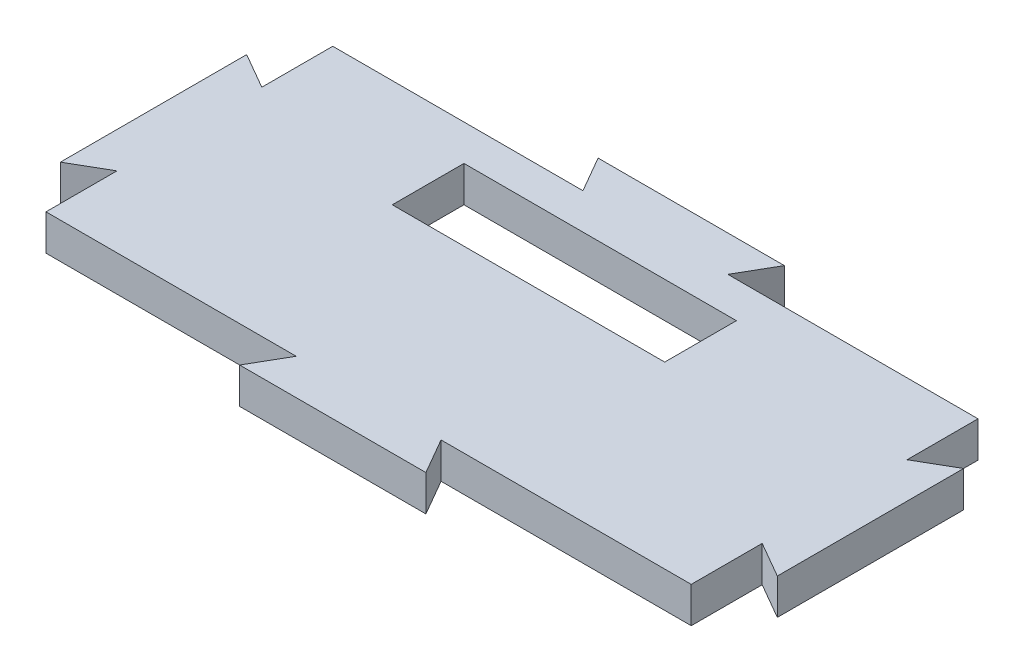
ISO-10303-21;
HEADER;
FILE_DESCRIPTION(('STEP AP214'),'2;1');
FILE_NAME('part.step','',(''),(''),'','','');
FILE_SCHEMA(('AUTOMOTIVE_DESIGN { 1 0 10303 214 1 1 1 1 }'));
ENDSEC;
DATA;
#1=APPLICATION_CONTEXT('core data for automotive mechanical design processes');
#2=APPLICATION_PROTOCOL_DEFINITION('international standard','automotive_design',2000,#1);
#3=PRODUCT_CONTEXT('',#1,'mechanical');
#4=PRODUCT('Part','Part','',(#3));
#5=PRODUCT_RELATED_PRODUCT_CATEGORY('part','',(#4));
#6=PRODUCT_DEFINITION_FORMATION('','',#4);
#7=PRODUCT_DEFINITION_CONTEXT('part definition',#1,'design');
#8=PRODUCT_DEFINITION('design','',#6,#7);
#9=PRODUCT_DEFINITION_SHAPE('','',#8);
#10=(LENGTH_UNIT() NAMED_UNIT(*) SI_UNIT(.MILLI.,.METRE.));
#11=(NAMED_UNIT(*) PLANE_ANGLE_UNIT() SI_UNIT($,.RADIAN.));
#12=(NAMED_UNIT(*) SI_UNIT($,.STERADIAN.) SOLID_ANGLE_UNIT());
#13=UNCERTAINTY_MEASURE_WITH_UNIT(LENGTH_MEASURE(1.E-05),#10,'distance_accuracy_value','');
#14=(GEOMETRIC_REPRESENTATION_CONTEXT(3) GLOBAL_UNCERTAINTY_ASSIGNED_CONTEXT((#13)) GLOBAL_UNIT_ASSIGNED_CONTEXT((#10,
#11,#12)) REPRESENTATION_CONTEXT('',''));
#15=CARTESIAN_POINT('',(0.,0.,0.));
#16=DIRECTION('',(0.,0.,1.));
#17=DIRECTION('',(1.,0.,0.));
#18=AXIS2_PLACEMENT_3D('',#15,#16,#17);
#19=CARTESIAN_POINT('',(0.,5.,0.));
#20=DIRECTION('',(0.,1.,0.));
#21=DIRECTION('',(0.,0.,1.));
#22=AXIS2_PLACEMENT_3D('',#19,#20,#21);
#23=PLANE('',#22);
#24=DIRECTION('',(1.,0.,0.));
#25=VECTOR('',#24,1.);
#26=CARTESIAN_POINT('',(16.3,5.,-5.));
#27=LINE('',#26,#25);
#28=CARTESIAN_POINT('',(-21.7,5.,-4.99999999999999));
#29=VERTEX_POINT('',#28);
#30=CARTESIAN_POINT('',(16.3,5.,-5.));
#31=VERTEX_POINT('',#30);
#32=EDGE_CURVE('E559',#29,#31,#27,.T.);
#33=ORIENTED_EDGE('',*,*,#32,.F.);
#34=DIRECTION('',(0.,0.,1.));
#35=VECTOR('',#34,1.);
#36=CARTESIAN_POINT('',(-21.7,5.,-15.));
#37=LINE('',#36,#35);
#38=CARTESIAN_POINT('',(-21.7,5.,-15.));
#39=VERTEX_POINT('',#38);
#40=EDGE_CURVE('E722',#39,#29,#37,.T.);
#41=ORIENTED_EDGE('',*,*,#40,.F.);
#42=DIRECTION('',(-1.,0.,0.));
#43=VECTOR('',#42,1.);
#44=CARTESIAN_POINT('',(16.3,5.,-15.));
#45=LINE('',#44,#43);
#46=CARTESIAN_POINT('',(16.3,5.,-15.));
#47=VERTEX_POINT('',#46);
#48=EDGE_CURVE('E707',#47,#39,#45,.T.);
#49=ORIENTED_EDGE('',*,*,#48,.F.);
#50=DIRECTION('',(0.,0.,-1.));
#51=VECTOR('',#50,1.);
#52=CARTESIAN_POINT('',(16.3,5.,-7.52957321654772));
#53=LINE('',#52,#51);
#54=EDGE_CURVE('E720',#31,#47,#53,.T.);
#55=ORIENTED_EDGE('',*,*,#54,.F.);
#56=EDGE_LOOP('',(#33,#41,#49,#55));
#57=FACE_BOUND('',#56,.T.);
#58=DIRECTION('',(0.866025403784438,0.,-0.5));
#59=VECTOR('',#58,1.);
#60=CARTESIAN_POINT('',(-50.,5.,12.9903810567666));
#61=LINE('',#60,#59);
#62=CARTESIAN_POINT('',(-50.,5.,12.9903810567666));
#63=VERTEX_POINT('',#62);
#64=CARTESIAN_POINT('',(-45.,5.,10.1036297108185));
#65=VERTEX_POINT('',#64);
#66=EDGE_CURVE('E795',#63,#65,#61,.T.);
#67=ORIENTED_EDGE('',*,*,#66,.T.);
#68=DIRECTION('',(0.,0.,1.));
#69=VECTOR('',#68,1.);
#70=CARTESIAN_POINT('',(-45.,5.,0.));
#71=LINE('',#70,#69);
#72=CARTESIAN_POINT('',(-45.,5.,20.));
#73=VERTEX_POINT('',#72);
#74=EDGE_CURVE('E734',#65,#73,#71,.T.);
#75=ORIENTED_EDGE('',*,*,#74,.T.);
#76=DIRECTION('',(-1.,0.,0.));
#77=VECTOR('',#76,1.);
#78=CARTESIAN_POINT('',(0.,5.,20.));
#79=LINE('',#78,#77);
#80=CARTESIAN_POINT('',(-10.1036297108184,5.,20.));
#81=VERTEX_POINT('',#80);
#82=EDGE_CURVE('E738',#81,#73,#79,.T.);
#83=ORIENTED_EDGE('',*,*,#82,.F.);
#84=DIRECTION('',(-0.5,0.,0.866025403784439));
#85=VECTOR('',#84,1.);
#86=CARTESIAN_POINT('',(0.,5.,2.49999999999999));
#87=LINE('',#86,#85);
#88=CARTESIAN_POINT('',(-12.9903810567666,5.,25.));
#89=VERTEX_POINT('',#88);
#90=EDGE_CURVE('E831',#81,#89,#87,.T.);
#91=ORIENTED_EDGE('',*,*,#90,.T.);
#92=DIRECTION('',(1.,0.,0.));
#93=VECTOR('',#92,1.);
#94=CARTESIAN_POINT('',(-12.9903810567666,5.,25.));
#95=LINE('',#94,#93);
#96=CARTESIAN_POINT('',(12.9903810567666,5.,25.));
#97=VERTEX_POINT('',#96);
#98=EDGE_CURVE('E834',#89,#97,#95,.T.);
#99=ORIENTED_EDGE('',*,*,#98,.T.);
#100=DIRECTION('',(-0.5,0.,-0.866025403784438));
#101=VECTOR('',#100,1.);
#102=CARTESIAN_POINT('',(12.9903810567666,5.,25.));
#103=LINE('',#102,#101);
#104=CARTESIAN_POINT('',(10.1036297108185,5.,20.));
#105=VERTEX_POINT('',#104);
#106=EDGE_CURVE('E839',#97,#105,#103,.T.);
#107=ORIENTED_EDGE('',*,*,#106,.T.);
#108=CARTESIAN_POINT('',(45.,5.,20.));
#109=VERTEX_POINT('',#108);
#110=EDGE_CURVE('E742',#109,#105,#79,.T.);
#111=ORIENTED_EDGE('',*,*,#110,.F.);
#112=DIRECTION('',(0.,0.,1.));
#113=VECTOR('',#112,1.);
#114=CARTESIAN_POINT('',(45.,5.,0.));
#115=LINE('',#114,#113);
#116=CARTESIAN_POINT('',(45.,5.,10.1036297108185));
#117=VERTEX_POINT('',#116);
#118=EDGE_CURVE('E745',#117,#109,#115,.T.);
#119=ORIENTED_EDGE('',*,*,#118,.F.);
#120=DIRECTION('',(-0.866025403784438,0.,-0.5));
#121=VECTOR('',#120,1.);
#122=CARTESIAN_POINT('',(50.,5.,12.9903810567666));
#123=LINE('',#122,#121);
#124=CARTESIAN_POINT('',(50.,5.,12.9903810567666));
#125=VERTEX_POINT('',#124);
#126=EDGE_CURVE('E818',#125,#117,#123,.T.);
#127=ORIENTED_EDGE('',*,*,#126,.F.);
#128=DIRECTION('',(0.,0.,1.));
#129=VECTOR('',#128,1.);
#130=CARTESIAN_POINT('',(50.,5.,-12.9903810567666));
#131=LINE('',#130,#129);
#132=CARTESIAN_POINT('',(50.,5.,-12.9903810567666));
#133=VERTEX_POINT('',#132);
#134=EDGE_CURVE('E812',#133,#125,#131,.T.);
#135=ORIENTED_EDGE('',*,*,#134,.F.);
#136=DIRECTION('',(0.866025403784438,0.,-0.5));
#137=VECTOR('',#136,1.);
#138=CARTESIAN_POINT('',(27.5,5.,0.));
#139=LINE('',#138,#137);
#140=CARTESIAN_POINT('',(45.,5.,-10.1036297108185));
#141=VERTEX_POINT('',#140);
#142=EDGE_CURVE('E815',#141,#133,#139,.T.);
#143=ORIENTED_EDGE('',*,*,#142,.F.);
#144=CARTESIAN_POINT('',(45.,5.,-20.));
#145=VERTEX_POINT('',#144);
#146=EDGE_CURVE('E743',#145,#141,#115,.T.);
#147=ORIENTED_EDGE('',*,*,#146,.F.);
#148=DIRECTION('',(-1.,0.,0.));
#149=VECTOR('',#148,1.);
#150=CARTESIAN_POINT('',(0.,5.,-20.));
#151=LINE('',#150,#149);
#152=CARTESIAN_POINT('',(10.1036297108185,5.,-20.));
#153=VERTEX_POINT('',#152);
#154=EDGE_CURVE('E748',#145,#153,#151,.T.);
#155=ORIENTED_EDGE('',*,*,#154,.T.);
#156=DIRECTION('',(-0.5,0.,0.866025403784438));
#157=VECTOR('',#156,1.);
#158=CARTESIAN_POINT('',(12.9903810567666,5.,-25.));
#159=LINE('',#158,#157);
#160=CARTESIAN_POINT('',(12.9903810567666,5.,-25.));
#161=VERTEX_POINT('',#160);
#162=EDGE_CURVE('E854',#161,#153,#159,.T.);
#163=ORIENTED_EDGE('',*,*,#162,.F.);
#164=DIRECTION('',(1.,0.,0.));
#165=VECTOR('',#164,1.);
#166=CARTESIAN_POINT('',(-12.9903810567666,5.,-25.));
#167=LINE('',#166,#165);
#168=CARTESIAN_POINT('',(-12.9903810567666,5.,-25.));
#169=VERTEX_POINT('',#168);
#170=EDGE_CURVE('E860',#169,#161,#167,.T.);
#171=ORIENTED_EDGE('',*,*,#170,.F.);
#172=DIRECTION('',(-0.5,0.,-0.866025403784439));
#173=VECTOR('',#172,1.);
#174=CARTESIAN_POINT('',(0.,5.,-2.49999999999999));
#175=LINE('',#174,#173);
#176=CARTESIAN_POINT('',(-10.1036297108184,5.,-20.));
#177=VERTEX_POINT('',#176);
#178=EDGE_CURVE('E858',#177,#169,#175,.T.);
#179=ORIENTED_EDGE('',*,*,#178,.F.);
#180=CARTESIAN_POINT('',(-45.,5.,-20.));
#181=VERTEX_POINT('',#180);
#182=EDGE_CURVE('E750',#177,#181,#151,.T.);
#183=ORIENTED_EDGE('',*,*,#182,.T.);
#184=CARTESIAN_POINT('',(-45.,5.,-10.1036297108184));
#185=VERTEX_POINT('',#184);
#186=EDGE_CURVE('E736',#181,#185,#71,.T.);
#187=ORIENTED_EDGE('',*,*,#186,.T.);
#188=DIRECTION('',(-0.866025403784438,0.,-0.5));
#189=VECTOR('',#188,1.);
#190=CARTESIAN_POINT('',(-27.5,5.,0.));
#191=LINE('',#190,#189);
#192=CARTESIAN_POINT('',(-50.,5.,-12.9903810567666));
#193=VERTEX_POINT('',#192);
#194=EDGE_CURVE('E794',#185,#193,#191,.T.);
#195=ORIENTED_EDGE('',*,*,#194,.T.);
#196=DIRECTION('',(0.,0.,1.));
#197=VECTOR('',#196,1.);
#198=CARTESIAN_POINT('',(-50.,5.,-12.9903810567666));
#199=LINE('',#198,#197);
#200=EDGE_CURVE('E799',#193,#63,#199,.T.);
#201=ORIENTED_EDGE('',*,*,#200,.T.);
#202=EDGE_LOOP('',(#67,#75,#83,#91,#99,#107,#111,#119,#127,#135,#143,#147,#155,#163,#171,#179,
#183,#187,#195,#201));
#203=FACE_BOUND('',#202,.T.);
#204=ADVANCED_FACE('F544',(#57,#203),#23,.T.);
#205=CARTESIAN_POINT('',(0.,0.,0.));
#206=DIRECTION('',(0.,1.,0.));
#207=DIRECTION('',(0.,0.,1.));
#208=AXIS2_PLACEMENT_3D('',#205,#206,#207);
#209=PLANE('',#208);
#210=DIRECTION('',(0.,0.,1.));
#211=VECTOR('',#210,1.);
#212=CARTESIAN_POINT('',(-21.7,0.,0.));
#213=LINE('',#212,#211);
#214=CARTESIAN_POINT('',(-21.7,0.,-15.));
#215=VERTEX_POINT('',#214);
#216=CARTESIAN_POINT('',(-21.7,0.,-4.99999999999999));
#217=VERTEX_POINT('',#216);
#218=EDGE_CURVE('E554',#215,#217,#213,.T.);
#219=ORIENTED_EDGE('',*,*,#218,.T.);
#220=DIRECTION('',(1.,0.,0.));
#221=VECTOR('',#220,1.);
#222=CARTESIAN_POINT('',(0.,0.,-4.99999999999999));
#223=LINE('',#222,#221);
#224=CARTESIAN_POINT('',(16.3,0.,-5.));
#225=VERTEX_POINT('',#224);
#226=EDGE_CURVE('E12',#217,#225,#223,.T.);
#227=ORIENTED_EDGE('',*,*,#226,.T.);
#228=DIRECTION('',(0.,0.,-1.));
#229=VECTOR('',#228,1.);
#230=CARTESIAN_POINT('',(16.3,0.,0.));
#231=LINE('',#230,#229);
#232=CARTESIAN_POINT('',(16.3,0.,-15.));
#233=VERTEX_POINT('',#232);
#234=EDGE_CURVE('E793',#225,#233,#231,.T.);
#235=ORIENTED_EDGE('',*,*,#234,.T.);
#236=DIRECTION('',(-1.,0.,0.));
#237=VECTOR('',#236,1.);
#238=CARTESIAN_POINT('',(0.,0.,-15.));
#239=LINE('',#238,#237);
#240=EDGE_CURVE('E715',#233,#215,#239,.T.);
#241=ORIENTED_EDGE('',*,*,#240,.T.);
#242=EDGE_LOOP('',(#219,#227,#235,#241));
#243=FACE_BOUND('',#242,.T.);
#244=DIRECTION('',(0.,0.,1.));
#245=VECTOR('',#244,1.);
#246=CARTESIAN_POINT('',(-45.,0.,0.));
#247=LINE('',#246,#245);
#248=CARTESIAN_POINT('',(-45.,0.,10.1036297108185));
#249=VERTEX_POINT('',#248);
#250=CARTESIAN_POINT('',(-45.,0.,20.));
#251=VERTEX_POINT('',#250);
#252=EDGE_CURVE('E749',#249,#251,#247,.T.);
#253=ORIENTED_EDGE('',*,*,#252,.F.);
#254=DIRECTION('',(0.866025403784438,0.,-0.5));
#255=VECTOR('',#254,1.);
#256=CARTESIAN_POINT('',(-50.,0.,12.9903810567666));
#257=LINE('',#256,#255);
#258=CARTESIAN_POINT('',(-50.,0.,12.9903810567666));
#259=VERTEX_POINT('',#258);
#260=EDGE_CURVE('E803',#259,#249,#257,.T.);
#261=ORIENTED_EDGE('',*,*,#260,.F.);
#262=DIRECTION('',(0.,0.,1.));
#263=VECTOR('',#262,1.);
#264=CARTESIAN_POINT('',(-50.,0.,-12.9903810567666));
#265=LINE('',#264,#263);
#266=CARTESIAN_POINT('',(-50.,0.,-12.9903810567666));
#267=VERTEX_POINT('',#266);
#268=EDGE_CURVE('E797',#267,#259,#265,.T.);
#269=ORIENTED_EDGE('',*,*,#268,.F.);
#270=DIRECTION('',(-0.866025403784438,0.,-0.5));
#271=VECTOR('',#270,1.);
#272=CARTESIAN_POINT('',(-27.5,0.,0.));
#273=LINE('',#272,#271);
#274=CARTESIAN_POINT('',(-45.,0.,-10.1036297108184));
#275=VERTEX_POINT('',#274);
#276=EDGE_CURVE('E805',#275,#267,#273,.T.);
#277=ORIENTED_EDGE('',*,*,#276,.F.);
#278=CARTESIAN_POINT('',(-45.,0.,-20.));
#279=VERTEX_POINT('',#278);
#280=EDGE_CURVE('E740',#279,#275,#247,.T.);
#281=ORIENTED_EDGE('',*,*,#280,.F.);
#282=DIRECTION('',(-1.,0.,0.));
#283=VECTOR('',#282,1.);
#284=CARTESIAN_POINT('',(0.,0.,-20.));
#285=LINE('',#284,#283);
#286=CARTESIAN_POINT('',(-10.1036297108184,0.,-20.));
#287=VERTEX_POINT('',#286);
#288=EDGE_CURVE('E764',#287,#279,#285,.T.);
#289=ORIENTED_EDGE('',*,*,#288,.F.);
#290=DIRECTION('',(-0.5,0.,-0.866025403784439));
#291=VECTOR('',#290,1.);
#292=CARTESIAN_POINT('',(0.,0.,-2.49999999999999));
#293=LINE('',#292,#291);
#294=CARTESIAN_POINT('',(-12.9903810567666,0.,-25.));
#295=VERTEX_POINT('',#294);
#296=EDGE_CURVE('E862',#287,#295,#293,.T.);
#297=ORIENTED_EDGE('',*,*,#296,.T.);
#298=DIRECTION('',(1.,0.,0.));
#299=VECTOR('',#298,1.);
#300=CARTESIAN_POINT('',(-12.9903810567666,0.,-25.));
#301=LINE('',#300,#299);
#302=CARTESIAN_POINT('',(12.9903810567666,0.,-25.));
#303=VERTEX_POINT('',#302);
#304=EDGE_CURVE('E857',#295,#303,#301,.T.);
#305=ORIENTED_EDGE('',*,*,#304,.T.);
#306=DIRECTION('',(-0.5,0.,0.866025403784438));
#307=VECTOR('',#306,1.);
#308=CARTESIAN_POINT('',(12.9903810567666,0.,-25.));
#309=LINE('',#308,#307);
#310=CARTESIAN_POINT('',(10.1036297108185,0.,-20.));
#311=VERTEX_POINT('',#310);
#312=EDGE_CURVE('E728',#303,#311,#309,.T.);
#313=ORIENTED_EDGE('',*,*,#312,.T.);
#314=CARTESIAN_POINT('',(45.,0.,-20.));
#315=VERTEX_POINT('',#314);
#316=EDGE_CURVE('E765',#315,#311,#285,.T.);
#317=ORIENTED_EDGE('',*,*,#316,.F.);
#318=DIRECTION('',(0.,0.,1.));
#319=VECTOR('',#318,1.);
#320=CARTESIAN_POINT('',(45.,0.,0.));
#321=LINE('',#320,#319);
#322=CARTESIAN_POINT('',(45.,0.,-10.1036297108185));
#323=VERTEX_POINT('',#322);
#324=EDGE_CURVE('E761',#315,#323,#321,.T.);
#325=ORIENTED_EDGE('',*,*,#324,.T.);
#326=DIRECTION('',(0.866025403784438,0.,-0.5));
#327=VECTOR('',#326,1.);
#328=CARTESIAN_POINT('',(27.5,0.,0.));
#329=LINE('',#328,#327);
#330=CARTESIAN_POINT('',(50.,0.,-12.9903810567666));
#331=VERTEX_POINT('',#330);
#332=EDGE_CURVE('E825',#323,#331,#329,.T.);
#333=ORIENTED_EDGE('',*,*,#332,.T.);
#334=DIRECTION('',(0.,0.,1.));
#335=VECTOR('',#334,1.);
#336=CARTESIAN_POINT('',(50.,0.,-12.9903810567666));
#337=LINE('',#336,#335);
#338=CARTESIAN_POINT('',(50.,0.,12.9903810567666));
#339=VERTEX_POINT('',#338);
#340=EDGE_CURVE('E823',#331,#339,#337,.T.);
#341=ORIENTED_EDGE('',*,*,#340,.T.);
#342=DIRECTION('',(-0.866025403784438,0.,-0.5));
#343=VECTOR('',#342,1.);
#344=CARTESIAN_POINT('',(50.,0.,12.9903810567666));
#345=LINE('',#344,#343);
#346=CARTESIAN_POINT('',(45.,0.,10.1036297108185));
#347=VERTEX_POINT('',#346);
#348=EDGE_CURVE('E814',#339,#347,#345,.T.);
#349=ORIENTED_EDGE('',*,*,#348,.T.);
#350=CARTESIAN_POINT('',(45.,0.,20.));
#351=VERTEX_POINT('',#350);
#352=EDGE_CURVE('E758',#347,#351,#321,.T.);
#353=ORIENTED_EDGE('',*,*,#352,.T.);
#354=DIRECTION('',(-1.,0.,0.));
#355=VECTOR('',#354,1.);
#356=CARTESIAN_POINT('',(0.,0.,20.));
#357=LINE('',#356,#355);
#358=CARTESIAN_POINT('',(10.1036297108185,0.,20.));
#359=VERTEX_POINT('',#358);
#360=EDGE_CURVE('E760',#351,#359,#357,.T.);
#361=ORIENTED_EDGE('',*,*,#360,.T.);
#362=DIRECTION('',(-0.5,0.,-0.866025403784438));
#363=VECTOR('',#362,1.);
#364=CARTESIAN_POINT('',(12.9903810567666,0.,25.));
#365=LINE('',#364,#363);
#366=CARTESIAN_POINT('',(12.9903810567666,0.,25.));
#367=VERTEX_POINT('',#366);
#368=EDGE_CURVE('E837',#367,#359,#365,.T.);
#369=ORIENTED_EDGE('',*,*,#368,.F.);
#370=DIRECTION('',(1.,0.,0.));
#371=VECTOR('',#370,1.);
#372=CARTESIAN_POINT('',(-12.9903810567666,0.,25.));
#373=LINE('',#372,#371);
#374=CARTESIAN_POINT('',(-12.9903810567666,0.,25.));
#375=VERTEX_POINT('',#374);
#376=EDGE_CURVE('E844',#375,#367,#373,.T.);
#377=ORIENTED_EDGE('',*,*,#376,.F.);
#378=DIRECTION('',(-0.5,0.,0.866025403784439));
#379=VECTOR('',#378,1.);
#380=CARTESIAN_POINT('',(0.,0.,2.49999999999999));
#381=LINE('',#380,#379);
#382=CARTESIAN_POINT('',(-10.1036297108184,0.,20.));
#383=VERTEX_POINT('',#382);
#384=EDGE_CURVE('E845',#383,#375,#381,.T.);
#385=ORIENTED_EDGE('',*,*,#384,.F.);
#386=EDGE_CURVE('E751',#383,#251,#357,.T.);
#387=ORIENTED_EDGE('',*,*,#386,.T.);
#388=EDGE_LOOP('',(#253,#261,#269,#277,#281,#289,#297,#305,#313,#317,#325,#333,#341,#349,#353,
#361,#369,#377,#385,#387));
#389=FACE_BOUND('',#388,.T.);
#390=ADVANCED_FACE('F874',(#243,#389),#209,.F.);
#391=CARTESIAN_POINT('',(-45.,5.,0.));
#392=DIRECTION('',(1.,0.,0.));
#393=DIRECTION('',(0.,0.,-1.));
#394=AXIS2_PLACEMENT_3D('',#391,#392,#393);
#395=PLANE('',#394);
#396=ORIENTED_EDGE('',*,*,#252,.T.);
#397=DIRECTION('',(0.,-1.,0.));
#398=VECTOR('',#397,1.);
#399=CARTESIAN_POINT('',(-45.,5.,20.));
#400=LINE('',#399,#398);
#401=EDGE_CURVE('E790',#73,#251,#400,.T.);
#402=ORIENTED_EDGE('',*,*,#401,.F.);
#403=ORIENTED_EDGE('',*,*,#74,.F.);
#404=DIRECTION('',(0.,-1.,0.));
#405=VECTOR('',#404,1.);
#406=CARTESIAN_POINT('',(-45.,5.,10.1036297108185));
#407=LINE('',#406,#405);
#408=EDGE_CURVE('E789',#65,#249,#407,.T.);
#409=ORIENTED_EDGE('',*,*,#408,.T.);
#410=EDGE_LOOP('',(#396,#402,#403,#409));
#411=FACE_BOUND('',#410,.T.);
#412=ADVANCED_FACE('F893',(#411),#395,.F.);
#413=CARTESIAN_POINT('',(0.,5.,20.));
#414=DIRECTION('',(0.,0.,1.));
#415=DIRECTION('',(1.,0.,0.));
#416=AXIS2_PLACEMENT_3D('',#413,#414,#415);
#417=PLANE('',#416);
#418=ORIENTED_EDGE('',*,*,#386,.F.);
#419=DIRECTION('',(0.,-1.,0.));
#420=VECTOR('',#419,1.);
#421=CARTESIAN_POINT('',(-10.1036297108184,5.,20.));
#422=LINE('',#421,#420);
#423=EDGE_CURVE('E783',#81,#383,#422,.T.);
#424=ORIENTED_EDGE('',*,*,#423,.F.);
#425=ORIENTED_EDGE('',*,*,#82,.T.);
#426=ORIENTED_EDGE('',*,*,#401,.T.);
#427=EDGE_LOOP('',(#418,#424,#425,#426));
#428=FACE_BOUND('',#427,.T.);
#429=ADVANCED_FACE('F903',(#428),#417,.T.);
#430=ORIENTED_EDGE('',*,*,#360,.F.);
#431=DIRECTION('',(0.,-1.,0.));
#432=VECTOR('',#431,1.);
#433=CARTESIAN_POINT('',(45.,5.,20.));
#434=LINE('',#433,#432);
#435=EDGE_CURVE('E782',#109,#351,#434,.T.);
#436=ORIENTED_EDGE('',*,*,#435,.F.);
#437=ORIENTED_EDGE('',*,*,#110,.T.);
#438=DIRECTION('',(0.,-1.,0.));
#439=VECTOR('',#438,1.);
#440=CARTESIAN_POINT('',(10.1036297108185,5.,20.));
#441=LINE('',#440,#439);
#442=EDGE_CURVE('E784',#105,#359,#441,.T.);
#443=ORIENTED_EDGE('',*,*,#442,.T.);
#444=EDGE_LOOP('',(#430,#436,#437,#443));
#445=FACE_BOUND('',#444,.T.);
#446=ADVANCED_FACE('F920',(#445),#417,.T.);
#447=CARTESIAN_POINT('',(45.,5.,0.));
#448=DIRECTION('',(1.,0.,0.));
#449=DIRECTION('',(0.,0.,-1.));
#450=AXIS2_PLACEMENT_3D('',#447,#448,#449);
#451=PLANE('',#450);
#452=ORIENTED_EDGE('',*,*,#352,.F.);
#453=DIRECTION('',(0.,-1.,0.));
#454=VECTOR('',#453,1.);
#455=CARTESIAN_POINT('',(45.,5.,10.1036297108185));
#456=LINE('',#455,#454);
#457=EDGE_CURVE('E777',#117,#347,#456,.T.);
#458=ORIENTED_EDGE('',*,*,#457,.F.);
#459=ORIENTED_EDGE('',*,*,#118,.T.);
#460=ORIENTED_EDGE('',*,*,#435,.T.);
#461=EDGE_LOOP('',(#452,#458,#459,#460));
#462=FACE_BOUND('',#461,.T.);
#463=ADVANCED_FACE('F937',(#462),#451,.T.);
#464=ORIENTED_EDGE('',*,*,#324,.F.);
#465=DIRECTION('',(0.,-1.,0.));
#466=VECTOR('',#465,1.);
#467=CARTESIAN_POINT('',(45.,5.,-20.));
#468=LINE('',#467,#466);
#469=EDGE_CURVE('E773',#145,#315,#468,.T.);
#470=ORIENTED_EDGE('',*,*,#469,.F.);
#471=ORIENTED_EDGE('',*,*,#146,.T.);
#472=DIRECTION('',(0.,-1.,0.));
#473=VECTOR('',#472,1.);
#474=CARTESIAN_POINT('',(45.,5.,-10.1036297108185));
#475=LINE('',#474,#473);
#476=EDGE_CURVE('E780',#141,#323,#475,.T.);
#477=ORIENTED_EDGE('',*,*,#476,.T.);
#478=EDGE_LOOP('',(#464,#470,#471,#477));
#479=FACE_BOUND('',#478,.T.);
#480=ADVANCED_FACE('F929',(#479),#451,.T.);
#481=CARTESIAN_POINT('',(0.,5.,-20.));
#482=DIRECTION('',(0.,0.,1.));
#483=DIRECTION('',(1.,0.,0.));
#484=AXIS2_PLACEMENT_3D('',#481,#482,#483);
#485=PLANE('',#484);
#486=ORIENTED_EDGE('',*,*,#316,.T.);
#487=DIRECTION('',(0.,-1.,0.));
#488=VECTOR('',#487,1.);
#489=CARTESIAN_POINT('',(10.1036297108185,5.,-20.));
#490=LINE('',#489,#488);
#491=EDGE_CURVE('E774',#153,#311,#490,.T.);
#492=ORIENTED_EDGE('',*,*,#491,.F.);
#493=ORIENTED_EDGE('',*,*,#154,.F.);
#494=ORIENTED_EDGE('',*,*,#469,.T.);
#495=EDGE_LOOP('',(#486,#492,#493,#494));
#496=FACE_BOUND('',#495,.T.);
#497=ADVANCED_FACE('F955',(#496),#485,.F.);
#498=ORIENTED_EDGE('',*,*,#288,.T.);
#499=DIRECTION('',(0.,-1.,0.));
#500=VECTOR('',#499,1.);
#501=CARTESIAN_POINT('',(-45.,5.,-20.));
#502=LINE('',#501,#500);
#503=EDGE_CURVE('E767',#181,#279,#502,.T.);
#504=ORIENTED_EDGE('',*,*,#503,.F.);
#505=ORIENTED_EDGE('',*,*,#182,.F.);
#506=DIRECTION('',(0.,-1.,0.));
#507=VECTOR('',#506,1.);
#508=CARTESIAN_POINT('',(-10.1036297108184,5.,-20.));
#509=LINE('',#508,#507);
#510=EDGE_CURVE('E772',#177,#287,#509,.T.);
#511=ORIENTED_EDGE('',*,*,#510,.T.);
#512=EDGE_LOOP('',(#498,#504,#505,#511));
#513=FACE_BOUND('',#512,.T.);
#514=ADVANCED_FACE('F892',(#513),#485,.F.);
#515=ORIENTED_EDGE('',*,*,#280,.T.);
#516=DIRECTION('',(0.,-1.,0.));
#517=VECTOR('',#516,1.);
#518=CARTESIAN_POINT('',(-45.,5.,-10.1036297108184));
#519=LINE('',#518,#517);
#520=EDGE_CURVE('E766',#185,#275,#519,.T.);
#521=ORIENTED_EDGE('',*,*,#520,.F.);
#522=ORIENTED_EDGE('',*,*,#186,.F.);
#523=ORIENTED_EDGE('',*,*,#503,.T.);
#524=EDGE_LOOP('',(#515,#521,#522,#523));
#525=FACE_BOUND('',#524,.T.);
#526=ADVANCED_FACE('F891',(#525),#395,.F.);
#527=CARTESIAN_POINT('',(-50.,5.,-12.9903810567666));
#528=DIRECTION('',(1.,0.,0.));
#529=DIRECTION('',(0.,0.,-1.));
#530=AXIS2_PLACEMENT_3D('',#527,#528,#529);
#531=PLANE('',#530);
#532=ORIENTED_EDGE('',*,*,#268,.T.);
#533=DIRECTION('',(0.,-1.,0.));
#534=VECTOR('',#533,1.);
#535=CARTESIAN_POINT('',(-50.,5.,12.9903810567666));
#536=LINE('',#535,#534);
#537=EDGE_CURVE('E798',#63,#259,#536,.T.);
#538=ORIENTED_EDGE('',*,*,#537,.F.);
#539=ORIENTED_EDGE('',*,*,#200,.F.);
#540=DIRECTION('',(0.,-1.,0.));
#541=VECTOR('',#540,1.);
#542=CARTESIAN_POINT('',(-50.,5.,-12.9903810567666));
#543=LINE('',#542,#541);
#544=EDGE_CURVE('E754',#193,#267,#543,.T.);
#545=ORIENTED_EDGE('',*,*,#544,.T.);
#546=EDGE_LOOP('',(#532,#538,#539,#545));
#547=FACE_BOUND('',#546,.T.);
#548=ADVANCED_FACE('F900',(#547),#531,.F.);
#549=CARTESIAN_POINT('',(-27.5,5.,0.));
#550=DIRECTION('',(-0.5,0.,0.866025403784439));
#551=DIRECTION('',(0.866025403784439,0.,0.5));
#552=AXIS2_PLACEMENT_3D('',#549,#550,#551);
#553=PLANE('',#552);
#554=ORIENTED_EDGE('',*,*,#520,.T.);
#555=ORIENTED_EDGE('',*,*,#276,.T.);
#556=ORIENTED_EDGE('',*,*,#544,.F.);
#557=ORIENTED_EDGE('',*,*,#194,.F.);
#558=EDGE_LOOP('',(#554,#555,#556,#557));
#559=FACE_BOUND('',#558,.T.);
#560=ADVANCED_FACE('F907',(#559),#553,.F.);
#561=CARTESIAN_POINT('',(-50.,5.,12.9903810567666));
#562=DIRECTION('',(-0.5,0.,-0.866025403784439));
#563=DIRECTION('',(-0.866025403784439,0.,0.5));
#564=AXIS2_PLACEMENT_3D('',#561,#562,#563);
#565=PLANE('',#564);
#566=ORIENTED_EDGE('',*,*,#408,.F.);
#567=ORIENTED_EDGE('',*,*,#66,.F.);
#568=ORIENTED_EDGE('',*,*,#537,.T.);
#569=ORIENTED_EDGE('',*,*,#260,.T.);
#570=EDGE_LOOP('',(#566,#567,#568,#569));
#571=FACE_BOUND('',#570,.T.);
#572=ADVANCED_FACE('F902',(#571),#565,.F.);
#573=CARTESIAN_POINT('',(-12.9903810567666,5.,25.));
#574=DIRECTION('',(0.,0.,-1.));
#575=DIRECTION('',(-1.,0.,0.));
#576=AXIS2_PLACEMENT_3D('',#573,#574,#575);
#577=PLANE('',#576);
#578=ORIENTED_EDGE('',*,*,#376,.T.);
#579=DIRECTION('',(0.,-1.,0.));
#580=VECTOR('',#579,1.);
#581=CARTESIAN_POINT('',(12.9903810567666,5.,25.));
#582=LINE('',#581,#580);
#583=EDGE_CURVE('E842',#97,#367,#582,.T.);
#584=ORIENTED_EDGE('',*,*,#583,.F.);
#585=ORIENTED_EDGE('',*,*,#98,.F.);
#586=DIRECTION('',(0.,-1.,0.));
#587=VECTOR('',#586,1.);
#588=CARTESIAN_POINT('',(-12.9903810567666,5.,25.));
#589=LINE('',#588,#587);
#590=EDGE_CURVE('E824',#89,#375,#589,.T.);
#591=ORIENTED_EDGE('',*,*,#590,.T.);
#592=EDGE_LOOP('',(#578,#584,#585,#591));
#593=FACE_BOUND('',#592,.T.);
#594=ADVANCED_FACE('F925',(#593),#577,.F.);
#595=CARTESIAN_POINT('',(12.9903810567666,5.,25.));
#596=DIRECTION('',(-0.866025403784439,0.,0.5));
#597=DIRECTION('',(0.5,0.,0.866025403784439));
#598=AXIS2_PLACEMENT_3D('',#595,#596,#597);
#599=PLANE('',#598);
#600=ORIENTED_EDGE('',*,*,#368,.T.);
#601=ORIENTED_EDGE('',*,*,#442,.F.);
#602=ORIENTED_EDGE('',*,*,#106,.F.);
#603=ORIENTED_EDGE('',*,*,#583,.T.);
#604=EDGE_LOOP('',(#600,#601,#602,#603));
#605=FACE_BOUND('',#604,.T.);
#606=ADVANCED_FACE('F938',(#605),#599,.F.);
#607=CARTESIAN_POINT('',(0.,5.,2.49999999999999));
#608=DIRECTION('',(0.866025403784439,0.,0.5));
#609=DIRECTION('',(0.5,0.,-0.866025403784439));
#610=AXIS2_PLACEMENT_3D('',#607,#608,#609);
#611=PLANE('',#610);
#612=ORIENTED_EDGE('',*,*,#90,.F.);
#613=ORIENTED_EDGE('',*,*,#423,.T.);
#614=ORIENTED_EDGE('',*,*,#384,.T.);
#615=ORIENTED_EDGE('',*,*,#590,.F.);
#616=EDGE_LOOP('',(#612,#613,#614,#615));
#617=FACE_BOUND('',#616,.T.);
#618=ADVANCED_FACE('F933',(#617),#611,.F.);
#619=CARTESIAN_POINT('',(50.,5.,-12.9903810567666));
#620=DIRECTION('',(1.,0.,0.));
#621=DIRECTION('',(0.,0.,-1.));
#622=AXIS2_PLACEMENT_3D('',#619,#620,#621);
#623=PLANE('',#622);
#624=ORIENTED_EDGE('',*,*,#340,.F.);
#625=DIRECTION('',(0.,-1.,0.));
#626=VECTOR('',#625,1.);
#627=CARTESIAN_POINT('',(50.,5.,-12.9903810567666));
#628=LINE('',#627,#626);
#629=EDGE_CURVE('E821',#133,#331,#628,.T.);
#630=ORIENTED_EDGE('',*,*,#629,.F.);
#631=ORIENTED_EDGE('',*,*,#134,.T.);
#632=DIRECTION('',(0.,-1.,0.));
#633=VECTOR('',#632,1.);
#634=CARTESIAN_POINT('',(50.,5.,12.9903810567666));
#635=LINE('',#634,#633);
#636=EDGE_CURVE('E804',#125,#339,#635,.T.);
#637=ORIENTED_EDGE('',*,*,#636,.T.);
#638=EDGE_LOOP('',(#624,#630,#631,#637));
#639=FACE_BOUND('',#638,.T.);
#640=ADVANCED_FACE('F931',(#639),#623,.T.);
#641=CARTESIAN_POINT('',(27.5,5.,0.));
#642=DIRECTION('',(-0.5,0.,-0.866025403784439));
#643=DIRECTION('',(-0.866025403784439,0.,0.5));
#644=AXIS2_PLACEMENT_3D('',#641,#642,#643);
#645=PLANE('',#644);
#646=ORIENTED_EDGE('',*,*,#476,.F.);
#647=ORIENTED_EDGE('',*,*,#142,.T.);
#648=ORIENTED_EDGE('',*,*,#629,.T.);
#649=ORIENTED_EDGE('',*,*,#332,.F.);
#650=EDGE_LOOP('',(#646,#647,#648,#649));
#651=FACE_BOUND('',#650,.T.);
#652=ADVANCED_FACE('F928',(#651),#645,.T.);
#653=CARTESIAN_POINT('',(50.,5.,12.9903810567666));
#654=DIRECTION('',(-0.5,0.,0.866025403784439));
#655=DIRECTION('',(0.866025403784439,0.,0.5));
#656=AXIS2_PLACEMENT_3D('',#653,#654,#655);
#657=PLANE('',#656);
#658=ORIENTED_EDGE('',*,*,#457,.T.);
#659=ORIENTED_EDGE('',*,*,#348,.F.);
#660=ORIENTED_EDGE('',*,*,#636,.F.);
#661=ORIENTED_EDGE('',*,*,#126,.T.);
#662=EDGE_LOOP('',(#658,#659,#660,#661));
#663=FACE_BOUND('',#662,.T.);
#664=ADVANCED_FACE('F922',(#663),#657,.T.);
#665=CARTESIAN_POINT('',(-12.9903810567666,5.,-25.));
#666=DIRECTION('',(0.,0.,-1.));
#667=DIRECTION('',(-1.,0.,0.));
#668=AXIS2_PLACEMENT_3D('',#665,#666,#667);
#669=PLANE('',#668);
#670=ORIENTED_EDGE('',*,*,#304,.F.);
#671=DIRECTION('',(0.,-1.,0.));
#672=VECTOR('',#671,1.);
#673=CARTESIAN_POINT('',(-12.9903810567666,5.,-25.));
#674=LINE('',#673,#672);
#675=EDGE_CURVE('E865',#169,#295,#674,.T.);
#676=ORIENTED_EDGE('',*,*,#675,.F.);
#677=ORIENTED_EDGE('',*,*,#170,.T.);
#678=DIRECTION('',(0.,-1.,0.));
#679=VECTOR('',#678,1.);
#680=CARTESIAN_POINT('',(12.9903810567666,5.,-25.));
#681=LINE('',#680,#679);
#682=EDGE_CURVE('E843',#161,#303,#681,.T.);
#683=ORIENTED_EDGE('',*,*,#682,.T.);
#684=EDGE_LOOP('',(#670,#676,#677,#683));
#685=FACE_BOUND('',#684,.T.);
#686=ADVANCED_FACE('F930',(#685),#669,.T.);
#687=CARTESIAN_POINT('',(0.,5.,-2.49999999999999));
#688=DIRECTION('',(-0.866025403784439,0.,0.5));
#689=DIRECTION('',(0.5,0.,0.866025403784439));
#690=AXIS2_PLACEMENT_3D('',#687,#688,#689);
#691=PLANE('',#690);
#692=ORIENTED_EDGE('',*,*,#296,.F.);
#693=ORIENTED_EDGE('',*,*,#510,.F.);
#694=ORIENTED_EDGE('',*,*,#178,.T.);
#695=ORIENTED_EDGE('',*,*,#675,.T.);
#696=EDGE_LOOP('',(#692,#693,#694,#695));
#697=FACE_BOUND('',#696,.T.);
#698=ADVANCED_FACE('F887',(#697),#691,.T.);
#699=CARTESIAN_POINT('',(12.9903810567666,5.,-25.));
#700=DIRECTION('',(0.866025403784439,0.,0.5));
#701=DIRECTION('',(0.5,0.,-0.866025403784439));
#702=AXIS2_PLACEMENT_3D('',#699,#700,#701);
#703=PLANE('',#702);
#704=ORIENTED_EDGE('',*,*,#162,.T.);
#705=ORIENTED_EDGE('',*,*,#491,.T.);
#706=ORIENTED_EDGE('',*,*,#312,.F.);
#707=ORIENTED_EDGE('',*,*,#682,.F.);
#708=EDGE_LOOP('',(#704,#705,#706,#707));
#709=FACE_BOUND('',#708,.T.);
#710=ADVANCED_FACE('F550',(#709),#703,.T.);
#711=CARTESIAN_POINT('',(16.3,-5.,-5.));
#712=DIRECTION('',(0.,0.,1.));
#713=DIRECTION('',(1.,0.,0.));
#714=AXIS2_PLACEMENT_3D('',#711,#712,#713);
#715=PLANE('',#714);
#716=DIRECTION('',(0.,1.,0.));
#717=VECTOR('',#716,1.);
#718=CARTESIAN_POINT('',(-21.7,-5.,-4.99999999999999));
#719=LINE('',#718,#717);
#720=EDGE_CURVE('E732',#217,#29,#719,.T.);
#721=ORIENTED_EDGE('',*,*,#720,.T.);
#722=ORIENTED_EDGE('',*,*,#32,.T.);
#723=DIRECTION('',(0.,1.,0.));
#724=VECTOR('',#723,1.);
#725=CARTESIAN_POINT('',(16.3,-5.,-5.));
#726=LINE('',#725,#724);
#727=EDGE_CURVE('E716',#225,#31,#726,.T.);
#728=ORIENTED_EDGE('',*,*,#727,.F.);
#729=ORIENTED_EDGE('',*,*,#226,.F.);
#730=EDGE_LOOP('',(#721,#722,#728,#729));
#731=FACE_BOUND('',#730,.T.);
#732=ADVANCED_FACE('F879',(#731),#715,.F.);
#733=CARTESIAN_POINT('',(-21.7,-5.,-15.));
#734=DIRECTION('',(-1.,0.,0.));
#735=DIRECTION('',(0.,0.,1.));
#736=AXIS2_PLACEMENT_3D('',#733,#734,#735);
#737=PLANE('',#736);
#738=DIRECTION('',(0.,1.,0.));
#739=VECTOR('',#738,1.);
#740=CARTESIAN_POINT('',(-21.7,-5.,-15.));
#741=LINE('',#740,#739);
#742=EDGE_CURVE('E713',#215,#39,#741,.T.);
#743=ORIENTED_EDGE('',*,*,#742,.T.);
#744=ORIENTED_EDGE('',*,*,#40,.T.);
#745=ORIENTED_EDGE('',*,*,#720,.F.);
#746=ORIENTED_EDGE('',*,*,#218,.F.);
#747=EDGE_LOOP('',(#743,#744,#745,#746));
#748=FACE_BOUND('',#747,.T.);
#749=ADVANCED_FACE('F878',(#748),#737,.F.);
#750=CARTESIAN_POINT('',(16.3,-5.,-15.));
#751=DIRECTION('',(0.,0.,-1.));
#752=DIRECTION('',(-1.,0.,0.));
#753=AXIS2_PLACEMENT_3D('',#750,#751,#752);
#754=PLANE('',#753);
#755=DIRECTION('',(0.,1.,0.));
#756=VECTOR('',#755,1.);
#757=CARTESIAN_POINT('',(16.3,-5.,-15.));
#758=LINE('',#757,#756);
#759=EDGE_CURVE('E566',#233,#47,#758,.T.);
#760=ORIENTED_EDGE('',*,*,#759,.T.);
#761=ORIENTED_EDGE('',*,*,#48,.T.);
#762=ORIENTED_EDGE('',*,*,#742,.F.);
#763=ORIENTED_EDGE('',*,*,#240,.F.);
#764=EDGE_LOOP('',(#760,#761,#762,#763));
#765=FACE_BOUND('',#764,.T.);
#766=ADVANCED_FACE('F706',(#765),#754,.F.);
#767=CARTESIAN_POINT('',(16.3,-5.,-7.52957321654772));
#768=DIRECTION('',(1.,0.,0.));
#769=DIRECTION('',(0.,0.,-1.));
#770=AXIS2_PLACEMENT_3D('',#767,#768,#769);
#771=PLANE('',#770);
#772=ORIENTED_EDGE('',*,*,#727,.T.);
#773=ORIENTED_EDGE('',*,*,#54,.T.);
#774=ORIENTED_EDGE('',*,*,#759,.F.);
#775=ORIENTED_EDGE('',*,*,#234,.F.);
#776=EDGE_LOOP('',(#772,#773,#774,#775));
#777=FACE_BOUND('',#776,.T.);
#778=ADVANCED_FACE('F719',(#777),#771,.F.);
#779=CLOSED_SHELL('',(#204,#390,#412,#429,#446,#463,#480,#497,#514,#526,#548,#560,#572,#594,
#606,#618,#640,#652,#664,#686,#698,#710,#732,#749,#766,#778));
#780=MANIFOLD_SOLID_BREP('B2',#779);
#781=ADVANCED_BREP_SHAPE_REPRESENTATION('',(#18,#780),#14);
#782=SHAPE_DEFINITION_REPRESENTATION(#9,#781);
ENDSEC;
END-ISO-10303-21;
